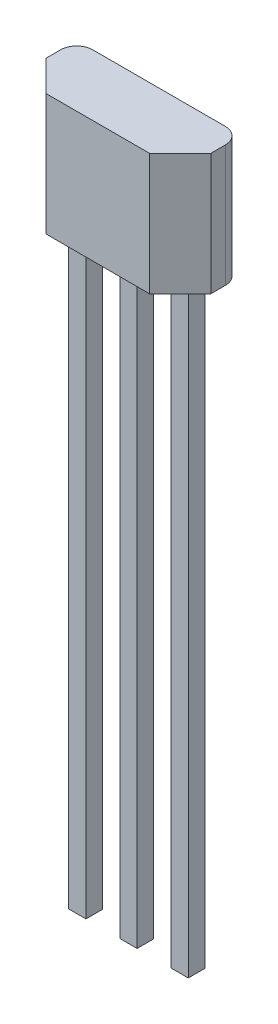
ISO-10303-21;
HEADER;
FILE_DESCRIPTION(('STEP AP214'),'2;1');
FILE_NAME('part.step','',(''),(''),'','','');
FILE_SCHEMA(('AUTOMOTIVE_DESIGN { 1 0 10303 214 1 1 1 1 }'));
ENDSEC;
DATA;
#1=APPLICATION_CONTEXT('core data for automotive mechanical design processes');
#2=APPLICATION_PROTOCOL_DEFINITION('international standard','automotive_design',2000,#1);
#3=PRODUCT_CONTEXT('',#1,'mechanical');
#4=PRODUCT('Part','Part','',(#3));
#5=PRODUCT_RELATED_PRODUCT_CATEGORY('part','',(#4));
#6=PRODUCT_DEFINITION_FORMATION('','',#4);
#7=PRODUCT_DEFINITION_CONTEXT('part definition',#1,'design');
#8=PRODUCT_DEFINITION('design','',#6,#7);
#9=PRODUCT_DEFINITION_SHAPE('','',#8);
#10=(LENGTH_UNIT() NAMED_UNIT(*) SI_UNIT(.MILLI.,.METRE.));
#11=(NAMED_UNIT(*) PLANE_ANGLE_UNIT() SI_UNIT($,.RADIAN.));
#12=(NAMED_UNIT(*) SI_UNIT($,.STERADIAN.) SOLID_ANGLE_UNIT());
#13=UNCERTAINTY_MEASURE_WITH_UNIT(LENGTH_MEASURE(1.E-05),#10,'distance_accuracy_value','');
#14=(GEOMETRIC_REPRESENTATION_CONTEXT(3) GLOBAL_UNCERTAINTY_ASSIGNED_CONTEXT((#13)) GLOBAL_UNIT_ASSIGNED_CONTEXT((#10,
#11,#12)) REPRESENTATION_CONTEXT('',''));
#15=CARTESIAN_POINT('',(0.,0.,0.));
#16=DIRECTION('',(0.,0.,1.));
#17=DIRECTION('',(1.,0.,0.));
#18=AXIS2_PLACEMENT_3D('',#15,#16,#17);
#19=CARTESIAN_POINT('',(1.645,0.,-0.360000000000001));
#20=DIRECTION('',(0.,1.,0.));
#21=DIRECTION('',(0.,0.,1.));
#22=AXIS2_PLACEMENT_3D('',#19,#20,#21);
#23=PLANE('',#22);
#24=DIRECTION('',(-1.,0.,0.));
#25=VECTOR('',#24,1.);
#26=CARTESIAN_POINT('',(1.485,0.,-0.41));
#27=LINE('',#26,#25);
#28=CARTESIAN_POINT('',(1.485,0.,-0.41));
#29=VERTEX_POINT('',#28);
#30=CARTESIAN_POINT('',(1.055,0.,-0.41));
#31=VERTEX_POINT('',#30);
#32=EDGE_CURVE('E213',#29,#31,#27,.T.);
#33=ORIENTED_EDGE('',*,*,#32,.T.);
#34=DIRECTION('',(0.,0.,1.));
#35=VECTOR('',#34,1.);
#36=CARTESIAN_POINT('',(1.055,0.,-0.41));
#37=LINE('',#36,#35);
#38=CARTESIAN_POINT('',(1.055,0.,0.));
#39=VERTEX_POINT('',#38);
#40=EDGE_CURVE('E236',#31,#39,#37,.T.);
#41=ORIENTED_EDGE('',*,*,#40,.T.);
#42=DIRECTION('',(-1.,0.,0.));
#43=VECTOR('',#42,1.);
#44=CARTESIAN_POINT('',(1.485,0.,0.));
#45=LINE('',#44,#43);
#46=CARTESIAN_POINT('',(1.485,0.,0.));
#47=VERTEX_POINT('',#46);
#48=EDGE_CURVE('E225',#47,#39,#45,.T.);
#49=ORIENTED_EDGE('',*,*,#48,.F.);
#50=DIRECTION('',(0.,0.,1.));
#51=VECTOR('',#50,1.);
#52=CARTESIAN_POINT('',(1.485,0.,-0.41));
#53=LINE('',#52,#51);
#54=EDGE_CURVE('E223',#29,#47,#53,.T.);
#55=ORIENTED_EDGE('',*,*,#54,.F.);
#56=EDGE_LOOP('',(#33,#41,#49,#55));
#57=FACE_BOUND('',#56,.T.);
#58=CARTESIAN_POINT('',(1.645,0.,-0.360000000000001));
#59=DIRECTION('',(0.,1.,0.));
#60=DIRECTION('',(0.,0.,1.));
#61=AXIS2_PLACEMENT_3D('',#58,#59,#60);
#62=CIRCLE('',#61,0.4);
#63=CARTESIAN_POINT('',(2.045,0.,-0.360000000000001));
#64=VERTEX_POINT('',#63);
#65=CARTESIAN_POINT('',(1.645,0.,-0.760000000000001));
#66=VERTEX_POINT('',#65);
#67=EDGE_CURVE('E265',#64,#66,#62,.T.);
#68=ORIENTED_EDGE('',*,*,#67,.F.);
#69=DIRECTION('',(0.,0.,-1.));
#70=VECTOR('',#69,1.);
#71=CARTESIAN_POINT('',(2.045,0.,-0.360000000000001));
#72=LINE('',#71,#70);
#73=CARTESIAN_POINT('',(2.045,0.,0.));
#74=VERTEX_POINT('',#73);
#75=EDGE_CURVE('E276',#74,#64,#72,.T.);
#76=ORIENTED_EDGE('',*,*,#75,.F.);
#77=DIRECTION('',(0.707106781186551,0.,-0.707106781186544));
#78=VECTOR('',#77,1.);
#79=CARTESIAN_POINT('',(2.045,0.,0.));
#80=LINE('',#79,#78);
#81=CARTESIAN_POINT('',(1.28499999999999,0.,0.76));
#82=VERTEX_POINT('',#81);
#83=EDGE_CURVE('E303',#82,#74,#80,.T.);
#84=ORIENTED_EDGE('',*,*,#83,.F.);
#85=DIRECTION('',(1.,0.,0.));
#86=VECTOR('',#85,1.);
#87=CARTESIAN_POINT('',(-1.285,0.,0.76));
#88=LINE('',#87,#86);
#89=CARTESIAN_POINT('',(-1.285,0.,0.76));
#90=VERTEX_POINT('',#89);
#91=EDGE_CURVE('E301',#90,#82,#88,.T.);
#92=ORIENTED_EDGE('',*,*,#91,.F.);
#93=DIRECTION('',(0.707106781186546,0.,0.707106781186549));
#94=VECTOR('',#93,1.);
#95=CARTESIAN_POINT('',(-2.045,0.,0.));
#96=LINE('',#95,#94);
#97=CARTESIAN_POINT('',(-2.045,0.,0.));
#98=VERTEX_POINT('',#97);
#99=EDGE_CURVE('E299',#98,#90,#96,.T.);
#100=ORIENTED_EDGE('',*,*,#99,.F.);
#101=DIRECTION('',(0.,0.,1.));
#102=VECTOR('',#101,1.);
#103=CARTESIAN_POINT('',(-2.045,0.,-0.36));
#104=LINE('',#103,#102);
#105=CARTESIAN_POINT('',(-2.045,0.,-0.36));
#106=VERTEX_POINT('',#105);
#107=EDGE_CURVE('E297',#106,#98,#104,.T.);
#108=ORIENTED_EDGE('',*,*,#107,.F.);
#109=CARTESIAN_POINT('',(-1.645,0.,-0.36));
#110=DIRECTION('',(0.,1.,0.));
#111=DIRECTION('',(0.,0.,1.));
#112=AXIS2_PLACEMENT_3D('',#109,#110,#111);
#113=CIRCLE('',#112,0.4);
#114=CARTESIAN_POINT('',(-1.645,0.,-0.76));
#115=VERTEX_POINT('',#114);
#116=EDGE_CURVE('E295',#115,#106,#113,.T.);
#117=ORIENTED_EDGE('',*,*,#116,.F.);
#118=DIRECTION('',(-1.,0.,0.));
#119=VECTOR('',#118,1.);
#120=CARTESIAN_POINT('',(-1.645,0.,-0.76));
#121=LINE('',#120,#119);
#122=EDGE_CURVE('E293',#66,#115,#121,.T.);
#123=ORIENTED_EDGE('',*,*,#122,.F.);
#124=EDGE_LOOP('',(#68,#76,#84,#92,#100,#108,#117,#123));
#125=FACE_BOUND('',#124,.T.);
#126=DIRECTION('',(-1.,0.,0.));
#127=VECTOR('',#126,1.);
#128=CARTESIAN_POINT('',(-0.215,0.,-0.41));
#129=LINE('',#128,#127);
#130=CARTESIAN_POINT('',(0.215,0.,-0.41));
#131=VERTEX_POINT('',#130);
#132=CARTESIAN_POINT('',(-0.215,0.,-0.41));
#133=VERTEX_POINT('',#132);
#134=EDGE_CURVE('E249',#131,#133,#129,.T.);
#135=ORIENTED_EDGE('',*,*,#134,.T.);
#136=DIRECTION('',(0.,0.,1.));
#137=VECTOR('',#136,1.);
#138=CARTESIAN_POINT('',(-0.215,0.,-0.41));
#139=LINE('',#138,#137);
#140=CARTESIAN_POINT('',(-0.215,0.,0.));
#141=VERTEX_POINT('',#140);
#142=EDGE_CURVE('E262',#133,#141,#139,.T.);
#143=ORIENTED_EDGE('',*,*,#142,.T.);
#144=DIRECTION('',(-1.,0.,0.));
#145=VECTOR('',#144,1.);
#146=CARTESIAN_POINT('',(-0.215,0.,0.));
#147=LINE('',#146,#145);
#148=CARTESIAN_POINT('',(0.215000000000002,0.,0.));
#149=VERTEX_POINT('',#148);
#150=EDGE_CURVE('E244',#149,#141,#147,.T.);
#151=ORIENTED_EDGE('',*,*,#150,.F.);
#152=DIRECTION('',(0.,0.,1.));
#153=VECTOR('',#152,1.);
#154=CARTESIAN_POINT('',(0.215,0.,-0.41));
#155=LINE('',#154,#153);
#156=EDGE_CURVE('E266',#131,#149,#155,.T.);
#157=ORIENTED_EDGE('',*,*,#156,.F.);
#158=EDGE_LOOP('',(#135,#143,#151,#157));
#159=FACE_BOUND('',#158,.T.);
#160=DIRECTION('',(-1.,0.,0.));
#161=VECTOR('',#160,1.);
#162=CARTESIAN_POINT('',(-1.485,0.,-0.41));
#163=LINE('',#162,#161);
#164=CARTESIAN_POINT('',(-1.055,0.,-0.41));
#165=VERTEX_POINT('',#164);
#166=CARTESIAN_POINT('',(-1.485,0.,-0.41));
#167=VERTEX_POINT('',#166);
#168=EDGE_CURVE('E182',#165,#167,#163,.T.);
#169=ORIENTED_EDGE('',*,*,#168,.T.);
#170=DIRECTION('',(0.,0.,1.));
#171=VECTOR('',#170,1.);
#172=CARTESIAN_POINT('',(-1.485,0.,-0.41));
#173=LINE('',#172,#171);
#174=CARTESIAN_POINT('',(-1.485,0.,0.));
#175=VERTEX_POINT('',#174);
#176=EDGE_CURVE('E195',#167,#175,#173,.T.);
#177=ORIENTED_EDGE('',*,*,#176,.T.);
#178=DIRECTION('',(-1.,0.,0.));
#179=VECTOR('',#178,1.);
#180=CARTESIAN_POINT('',(-1.485,0.,0.));
#181=LINE('',#180,#179);
#182=CARTESIAN_POINT('',(-1.055,0.,0.));
#183=VERTEX_POINT('',#182);
#184=EDGE_CURVE('E196',#183,#175,#181,.T.);
#185=ORIENTED_EDGE('',*,*,#184,.F.);
#186=DIRECTION('',(0.,0.,1.));
#187=VECTOR('',#186,1.);
#188=CARTESIAN_POINT('',(-1.055,0.,-0.41));
#189=LINE('',#188,#187);
#190=EDGE_CURVE('E207',#165,#183,#189,.T.);
#191=ORIENTED_EDGE('',*,*,#190,.F.);
#192=EDGE_LOOP('',(#169,#177,#185,#191));
#193=FACE_BOUND('',#192,.T.);
#194=ADVANCED_FACE('F32',(#57,#125,#159,#193),#23,.F.);
#195=CARTESIAN_POINT('',(1.645,3.02,-0.360000000000001));
#196=DIRECTION('',(0.,-1.,0.));
#197=DIRECTION('',(0.,0.,-1.));
#198=AXIS2_PLACEMENT_3D('',#195,#196,#197);
#199=CYLINDRICAL_SURFACE('',#198,0.4);
#200=ORIENTED_EDGE('',*,*,#67,.T.);
#201=DIRECTION('',(0.,-1.,0.));
#202=VECTOR('',#201,1.);
#203=CARTESIAN_POINT('',(1.645,3.02,-0.760000000000001));
#204=LINE('',#203,#202);
#205=CARTESIAN_POINT('',(1.645,3.02,-0.760000000000001));
#206=VERTEX_POINT('',#205);
#207=EDGE_CURVE('E11',#206,#66,#204,.T.);
#208=ORIENTED_EDGE('',*,*,#207,.F.);
#209=CARTESIAN_POINT('',(1.645,3.02,-0.360000000000001));
#210=DIRECTION('',(0.,1.,0.));
#211=DIRECTION('',(0.,0.,1.));
#212=AXIS2_PLACEMENT_3D('',#209,#210,#211);
#213=CIRCLE('',#212,0.4);
#214=CARTESIAN_POINT('',(2.045,3.02,-0.360000000000001));
#215=VERTEX_POINT('',#214);
#216=EDGE_CURVE('E272',#215,#206,#213,.T.);
#217=ORIENTED_EDGE('',*,*,#216,.F.);
#218=DIRECTION('',(0.,-1.,0.));
#219=VECTOR('',#218,1.);
#220=CARTESIAN_POINT('',(2.045,3.02,-0.360000000000001));
#221=LINE('',#220,#219);
#222=EDGE_CURVE('E290',#215,#64,#221,.T.);
#223=ORIENTED_EDGE('',*,*,#222,.T.);
#224=EDGE_LOOP('',(#200,#208,#217,#223));
#225=FACE_BOUND('',#224,.T.);
#226=ADVANCED_FACE('F34',(#225),#199,.T.);
#227=CARTESIAN_POINT('',(-1.645,3.02,-0.76));
#228=DIRECTION('',(0.,0.,1.));
#229=DIRECTION('',(1.,0.,0.));
#230=AXIS2_PLACEMENT_3D('',#227,#228,#229);
#231=PLANE('',#230);
#232=ORIENTED_EDGE('',*,*,#122,.T.);
#233=DIRECTION('',(0.,-1.,0.));
#234=VECTOR('',#233,1.);
#235=CARTESIAN_POINT('',(-1.645,3.02,-0.76));
#236=LINE('',#235,#234);
#237=CARTESIAN_POINT('',(-1.645,3.02,-0.76));
#238=VERTEX_POINT('',#237);
#239=EDGE_CURVE('E40',#238,#115,#236,.T.);
#240=ORIENTED_EDGE('',*,*,#239,.F.);
#241=DIRECTION('',(-1.,0.,0.));
#242=VECTOR('',#241,1.);
#243=CARTESIAN_POINT('',(-1.645,3.02,-0.76));
#244=LINE('',#243,#242);
#245=EDGE_CURVE('E275',#206,#238,#244,.T.);
#246=ORIENTED_EDGE('',*,*,#245,.F.);
#247=ORIENTED_EDGE('',*,*,#207,.T.);
#248=EDGE_LOOP('',(#232,#240,#246,#247));
#249=FACE_BOUND('',#248,.T.);
#250=ADVANCED_FACE('F350',(#249),#231,.F.);
#251=CARTESIAN_POINT('',(-1.645,3.02,-0.36));
#252=DIRECTION('',(0.,-1.,0.));
#253=DIRECTION('',(0.,0.,-1.));
#254=AXIS2_PLACEMENT_3D('',#251,#252,#253);
#255=CYLINDRICAL_SURFACE('',#254,0.4);
#256=ORIENTED_EDGE('',*,*,#116,.T.);
#257=DIRECTION('',(0.,-1.,0.));
#258=VECTOR('',#257,1.);
#259=CARTESIAN_POINT('',(-2.045,3.02,-0.36));
#260=LINE('',#259,#258);
#261=CARTESIAN_POINT('',(-2.045,3.02,-0.36));
#262=VERTEX_POINT('',#261);
#263=EDGE_CURVE('E320',#262,#106,#260,.T.);
#264=ORIENTED_EDGE('',*,*,#263,.F.);
#265=CARTESIAN_POINT('',(-1.645,3.02,-0.36));
#266=DIRECTION('',(0.,1.,0.));
#267=DIRECTION('',(0.,0.,1.));
#268=AXIS2_PLACEMENT_3D('',#265,#266,#267);
#269=CIRCLE('',#268,0.4);
#270=EDGE_CURVE('E278',#238,#262,#269,.T.);
#271=ORIENTED_EDGE('',*,*,#270,.F.);
#272=ORIENTED_EDGE('',*,*,#239,.T.);
#273=EDGE_LOOP('',(#256,#264,#271,#272));
#274=FACE_BOUND('',#273,.T.);
#275=ADVANCED_FACE('F327',(#274),#255,.T.);
#276=CARTESIAN_POINT('',(-2.045,3.02,-0.36));
#277=DIRECTION('',(1.,0.,0.));
#278=DIRECTION('',(0.,0.,-1.));
#279=AXIS2_PLACEMENT_3D('',#276,#277,#278);
#280=PLANE('',#279);
#281=ORIENTED_EDGE('',*,*,#107,.T.);
#282=DIRECTION('',(0.,-1.,0.));
#283=VECTOR('',#282,1.);
#284=CARTESIAN_POINT('',(-2.045,3.02,0.));
#285=LINE('',#284,#283);
#286=CARTESIAN_POINT('',(-2.045,3.02,0.));
#287=VERTEX_POINT('',#286);
#288=EDGE_CURVE('E317',#287,#98,#285,.T.);
#289=ORIENTED_EDGE('',*,*,#288,.F.);
#290=DIRECTION('',(0.,0.,1.));
#291=VECTOR('',#290,1.);
#292=CARTESIAN_POINT('',(-2.045,3.02,-0.36));
#293=LINE('',#292,#291);
#294=EDGE_CURVE('E280',#262,#287,#293,.T.);
#295=ORIENTED_EDGE('',*,*,#294,.F.);
#296=ORIENTED_EDGE('',*,*,#263,.T.);
#297=EDGE_LOOP('',(#281,#289,#295,#296));
#298=FACE_BOUND('',#297,.T.);
#299=ADVANCED_FACE('F338',(#298),#280,.F.);
#300=CARTESIAN_POINT('',(-2.045,3.02,0.));
#301=DIRECTION('',(0.707106781186549,0.,-0.707106781186546));
#302=DIRECTION('',(-0.707106781186546,0.,-0.707106781186549));
#303=AXIS2_PLACEMENT_3D('',#300,#301,#302);
#304=PLANE('',#303);
#305=ORIENTED_EDGE('',*,*,#99,.T.);
#306=DIRECTION('',(0.,-1.,0.));
#307=VECTOR('',#306,1.);
#308=CARTESIAN_POINT('',(-1.285,3.02,0.76));
#309=LINE('',#308,#307);
#310=CARTESIAN_POINT('',(-1.285,3.02,0.76));
#311=VERTEX_POINT('',#310);
#312=EDGE_CURVE('E314',#311,#90,#309,.T.);
#313=ORIENTED_EDGE('',*,*,#312,.F.);
#314=DIRECTION('',(0.707106781186546,0.,0.707106781186549));
#315=VECTOR('',#314,1.);
#316=CARTESIAN_POINT('',(-2.045,3.02,0.));
#317=LINE('',#316,#315);
#318=EDGE_CURVE('E282',#287,#311,#317,.T.);
#319=ORIENTED_EDGE('',*,*,#318,.F.);
#320=ORIENTED_EDGE('',*,*,#288,.T.);
#321=EDGE_LOOP('',(#305,#313,#319,#320));
#322=FACE_BOUND('',#321,.T.);
#323=ADVANCED_FACE('F342',(#322),#304,.F.);
#324=CARTESIAN_POINT('',(-1.285,3.02,0.76));
#325=DIRECTION('',(0.,0.,-1.));
#326=DIRECTION('',(-1.,0.,0.));
#327=AXIS2_PLACEMENT_3D('',#324,#325,#326);
#328=PLANE('',#327);
#329=ORIENTED_EDGE('',*,*,#91,.T.);
#330=DIRECTION('',(0.,-1.,0.));
#331=VECTOR('',#330,1.);
#332=CARTESIAN_POINT('',(1.28499999999999,3.02,0.76));
#333=LINE('',#332,#331);
#334=CARTESIAN_POINT('',(1.28499999999999,3.02,0.76));
#335=VERTEX_POINT('',#334);
#336=EDGE_CURVE('E311',#335,#82,#333,.T.);
#337=ORIENTED_EDGE('',*,*,#336,.F.);
#338=DIRECTION('',(1.,0.,0.));
#339=VECTOR('',#338,1.);
#340=CARTESIAN_POINT('',(-1.285,3.02,0.76));
#341=LINE('',#340,#339);
#342=EDGE_CURVE('E284',#311,#335,#341,.T.);
#343=ORIENTED_EDGE('',*,*,#342,.F.);
#344=ORIENTED_EDGE('',*,*,#312,.T.);
#345=EDGE_LOOP('',(#329,#337,#343,#344));
#346=FACE_BOUND('',#345,.T.);
#347=ADVANCED_FACE('F363',(#346),#328,.F.);
#348=CARTESIAN_POINT('',(2.045,3.02,0.));
#349=DIRECTION('',(-0.707106781186544,0.,-0.707106781186551));
#350=DIRECTION('',(-0.707106781186551,0.,0.707106781186544));
#351=AXIS2_PLACEMENT_3D('',#348,#349,#350);
#352=PLANE('',#351);
#353=ORIENTED_EDGE('',*,*,#83,.T.);
#354=DIRECTION('',(0.,-1.,0.));
#355=VECTOR('',#354,1.);
#356=CARTESIAN_POINT('',(2.045,3.02,0.));
#357=LINE('',#356,#355);
#358=CARTESIAN_POINT('',(2.045,3.02,0.));
#359=VERTEX_POINT('',#358);
#360=EDGE_CURVE('E308',#359,#74,#357,.T.);
#361=ORIENTED_EDGE('',*,*,#360,.F.);
#362=DIRECTION('',(0.707106781186551,0.,-0.707106781186544));
#363=VECTOR('',#362,1.);
#364=CARTESIAN_POINT('',(2.045,3.02,0.));
#365=LINE('',#364,#363);
#366=EDGE_CURVE('E286',#335,#359,#365,.T.);
#367=ORIENTED_EDGE('',*,*,#366,.F.);
#368=ORIENTED_EDGE('',*,*,#336,.T.);
#369=EDGE_LOOP('',(#353,#361,#367,#368));
#370=FACE_BOUND('',#369,.T.);
#371=ADVANCED_FACE('F361',(#370),#352,.F.);
#372=CARTESIAN_POINT('',(2.045,3.02,-0.360000000000001));
#373=DIRECTION('',(-1.,0.,0.));
#374=DIRECTION('',(0.,0.,1.));
#375=AXIS2_PLACEMENT_3D('',#372,#373,#374);
#376=PLANE('',#375);
#377=ORIENTED_EDGE('',*,*,#75,.T.);
#378=ORIENTED_EDGE('',*,*,#222,.F.);
#379=DIRECTION('',(0.,0.,-1.));
#380=VECTOR('',#379,1.);
#381=CARTESIAN_POINT('',(2.045,3.02,-0.360000000000001));
#382=LINE('',#381,#380);
#383=EDGE_CURVE('E288',#359,#215,#382,.T.);
#384=ORIENTED_EDGE('',*,*,#383,.F.);
#385=ORIENTED_EDGE('',*,*,#360,.T.);
#386=EDGE_LOOP('',(#377,#378,#384,#385));
#387=FACE_BOUND('',#386,.T.);
#388=ADVANCED_FACE('F356',(#387),#376,.F.);
#389=CARTESIAN_POINT('',(1.645,3.02,-0.360000000000001));
#390=DIRECTION('',(0.,1.,0.));
#391=DIRECTION('',(0.,0.,1.));
#392=AXIS2_PLACEMENT_3D('',#389,#390,#391);
#393=PLANE('',#392);
#394=ORIENTED_EDGE('',*,*,#216,.T.);
#395=ORIENTED_EDGE('',*,*,#245,.T.);
#396=ORIENTED_EDGE('',*,*,#270,.T.);
#397=ORIENTED_EDGE('',*,*,#294,.T.);
#398=ORIENTED_EDGE('',*,*,#318,.T.);
#399=ORIENTED_EDGE('',*,*,#342,.T.);
#400=ORIENTED_EDGE('',*,*,#366,.T.);
#401=ORIENTED_EDGE('',*,*,#383,.T.);
#402=EDGE_LOOP('',(#394,#395,#396,#397,#398,#399,#400,#401));
#403=FACE_BOUND('',#402,.T.);
#404=ADVANCED_FACE('F346',(#403),#393,.T.);
#405=CARTESIAN_POINT('',(-0.215,0.,-0.41));
#406=DIRECTION('',(-1.,0.,0.));
#407=DIRECTION('',(0.,-1.,0.));
#408=AXIS2_PLACEMENT_3D('',#405,#406,#407);
#409=PLANE('',#408);
#410=DIRECTION('',(0.,-1.,0.));
#411=VECTOR('',#410,1.);
#412=CARTESIAN_POINT('',(-0.215,0.,0.));
#413=LINE('',#412,#411);
#414=CARTESIAN_POINT('',(-0.214999999999996,-14.99,0.));
#415=VERTEX_POINT('',#414);
#416=EDGE_CURVE('E233',#141,#415,#413,.T.);
#417=ORIENTED_EDGE('',*,*,#416,.F.);
#418=ORIENTED_EDGE('',*,*,#142,.F.);
#419=DIRECTION('',(0.,-1.,0.));
#420=VECTOR('',#419,1.);
#421=CARTESIAN_POINT('',(-0.215,0.,-0.41));
#422=LINE('',#421,#420);
#423=CARTESIAN_POINT('',(-0.214999999999996,-14.99,-0.41));
#424=VERTEX_POINT('',#423);
#425=EDGE_CURVE('E240',#133,#424,#422,.T.);
#426=ORIENTED_EDGE('',*,*,#425,.T.);
#427=DIRECTION('',(0.,0.,1.));
#428=VECTOR('',#427,1.);
#429=CARTESIAN_POINT('',(-0.214999999999996,-14.99,-0.41));
#430=LINE('',#429,#428);
#431=EDGE_CURVE('E252',#424,#415,#430,.T.);
#432=ORIENTED_EDGE('',*,*,#431,.T.);
#433=EDGE_LOOP('',(#417,#418,#426,#432));
#434=FACE_BOUND('',#433,.T.);
#435=ADVANCED_FACE('F385',(#434),#409,.T.);
#436=CARTESIAN_POINT('',(0.215,0.,-0.41));
#437=DIRECTION('',(1.,0.,0.));
#438=DIRECTION('',(0.,1.,0.));
#439=AXIS2_PLACEMENT_3D('',#436,#437,#438);
#440=PLANE('',#439);
#441=DIRECTION('',(0.,1.,0.));
#442=VECTOR('',#441,1.);
#443=CARTESIAN_POINT('',(0.215,0.,0.));
#444=LINE('',#443,#442);
#445=CARTESIAN_POINT('',(0.215000000000002,-14.99,0.));
#446=VERTEX_POINT('',#445);
#447=EDGE_CURVE('E258',#446,#149,#444,.T.);
#448=ORIENTED_EDGE('',*,*,#447,.F.);
#449=DIRECTION('',(0.,0.,1.));
#450=VECTOR('',#449,1.);
#451=CARTESIAN_POINT('',(0.215000000000002,-14.99,-0.41));
#452=LINE('',#451,#450);
#453=CARTESIAN_POINT('',(0.215000000000002,-14.99,-0.41));
#454=VERTEX_POINT('',#453);
#455=EDGE_CURVE('E269',#454,#446,#452,.T.);
#456=ORIENTED_EDGE('',*,*,#455,.F.);
#457=DIRECTION('',(0.,1.,0.));
#458=VECTOR('',#457,1.);
#459=CARTESIAN_POINT('',(0.215,0.,-0.41));
#460=LINE('',#459,#458);
#461=EDGE_CURVE('E247',#454,#131,#460,.T.);
#462=ORIENTED_EDGE('',*,*,#461,.T.);
#463=ORIENTED_EDGE('',*,*,#156,.T.);
#464=EDGE_LOOP('',(#448,#456,#462,#463));
#465=FACE_BOUND('',#464,.T.);
#466=ADVANCED_FACE('F389',(#465),#440,.T.);
#467=CARTESIAN_POINT('',(-0.214999999999996,-14.99,-0.41));
#468=DIRECTION('',(0.,-1.,0.));
#469=DIRECTION('',(0.,0.,-1.));
#470=AXIS2_PLACEMENT_3D('',#467,#468,#469);
#471=PLANE('',#470);
#472=DIRECTION('',(1.,0.,0.));
#473=VECTOR('',#472,1.);
#474=CARTESIAN_POINT('',(-0.214999999999996,-14.99,0.));
#475=LINE('',#474,#473);
#476=EDGE_CURVE('E255',#415,#446,#475,.T.);
#477=ORIENTED_EDGE('',*,*,#476,.F.);
#478=ORIENTED_EDGE('',*,*,#431,.F.);
#479=DIRECTION('',(1.,0.,0.));
#480=VECTOR('',#479,1.);
#481=CARTESIAN_POINT('',(-0.214999999999996,-14.99,-0.41));
#482=LINE('',#481,#480);
#483=EDGE_CURVE('E243',#424,#454,#482,.T.);
#484=ORIENTED_EDGE('',*,*,#483,.T.);
#485=ORIENTED_EDGE('',*,*,#455,.T.);
#486=EDGE_LOOP('',(#477,#478,#484,#485));
#487=FACE_BOUND('',#486,.T.);
#488=ADVANCED_FACE('F394',(#487),#471,.T.);
#489=CARTESIAN_POINT('',(0.,0.,-0.41));
#490=DIRECTION('',(0.,0.,1.));
#491=DIRECTION('',(1.,0.,0.));
#492=AXIS2_PLACEMENT_3D('',#489,#490,#491);
#493=PLANE('',#492);
#494=ORIENTED_EDGE('',*,*,#425,.F.);
#495=ORIENTED_EDGE('',*,*,#134,.F.);
#496=ORIENTED_EDGE('',*,*,#461,.F.);
#497=ORIENTED_EDGE('',*,*,#483,.F.);
#498=EDGE_LOOP('',(#494,#495,#496,#497));
#499=FACE_BOUND('',#498,.T.);
#500=ADVANCED_FACE('F399',(#499),#493,.F.);
#501=CARTESIAN_POINT('',(0.,0.,0.));
#502=DIRECTION('',(0.,0.,1.));
#503=DIRECTION('',(1.,0.,0.));
#504=AXIS2_PLACEMENT_3D('',#501,#502,#503);
#505=PLANE('',#504);
#506=ORIENTED_EDGE('',*,*,#416,.T.);
#507=ORIENTED_EDGE('',*,*,#476,.T.);
#508=ORIENTED_EDGE('',*,*,#447,.T.);
#509=ORIENTED_EDGE('',*,*,#150,.T.);
#510=EDGE_LOOP('',(#506,#507,#508,#509));
#511=FACE_BOUND('',#510,.T.);
#512=ADVANCED_FACE('F402',(#511),#505,.T.);
#513=CARTESIAN_POINT('',(1.485,-14.99,-0.41));
#514=DIRECTION('',(1.,0.,0.));
#515=DIRECTION('',(0.,1.,0.));
#516=AXIS2_PLACEMENT_3D('',#513,#514,#515);
#517=PLANE('',#516);
#518=DIRECTION('',(0.,1.,0.));
#519=VECTOR('',#518,1.);
#520=CARTESIAN_POINT('',(1.485,-14.99,0.));
#521=LINE('',#520,#519);
#522=CARTESIAN_POINT('',(1.485,-14.99,0.));
#523=VERTEX_POINT('',#522);
#524=EDGE_CURVE('E55',#523,#47,#521,.T.);
#525=ORIENTED_EDGE('',*,*,#524,.F.);
#526=DIRECTION('',(0.,0.,1.));
#527=VECTOR('',#526,1.);
#528=CARTESIAN_POINT('',(1.485,-14.99,-0.41));
#529=LINE('',#528,#527);
#530=CARTESIAN_POINT('',(1.485,-14.99,-0.41));
#531=VERTEX_POINT('',#530);
#532=EDGE_CURVE('E231',#531,#523,#529,.T.);
#533=ORIENTED_EDGE('',*,*,#532,.F.);
#534=DIRECTION('',(0.,1.,0.));
#535=VECTOR('',#534,1.);
#536=CARTESIAN_POINT('',(1.485,-14.99,-0.41));
#537=LINE('',#536,#535);
#538=EDGE_CURVE('E210',#531,#29,#537,.T.);
#539=ORIENTED_EDGE('',*,*,#538,.T.);
#540=ORIENTED_EDGE('',*,*,#54,.T.);
#541=EDGE_LOOP('',(#525,#533,#539,#540));
#542=FACE_BOUND('',#541,.T.);
#543=ADVANCED_FACE('F405',(#542),#517,.T.);
#544=CARTESIAN_POINT('',(1.485,-14.99,-0.41));
#545=DIRECTION('',(0.,-1.,0.));
#546=DIRECTION('',(0.,0.,-1.));
#547=AXIS2_PLACEMENT_3D('',#544,#545,#546);
#548=PLANE('',#547);
#549=DIRECTION('',(1.,0.,0.));
#550=VECTOR('',#549,1.);
#551=CARTESIAN_POINT('',(1.485,-14.99,0.));
#552=LINE('',#551,#550);
#553=CARTESIAN_POINT('',(1.055,-14.99,0.));
#554=VERTEX_POINT('',#553);
#555=EDGE_CURVE('E214',#554,#523,#552,.T.);
#556=ORIENTED_EDGE('',*,*,#555,.F.);
#557=DIRECTION('',(0.,0.,1.));
#558=VECTOR('',#557,1.);
#559=CARTESIAN_POINT('',(1.055,-14.99,-0.41));
#560=LINE('',#559,#558);
#561=CARTESIAN_POINT('',(1.055,-14.99,-0.41));
#562=VERTEX_POINT('',#561);
#563=EDGE_CURVE('E234',#562,#554,#560,.T.);
#564=ORIENTED_EDGE('',*,*,#563,.F.);
#565=DIRECTION('',(1.,0.,0.));
#566=VECTOR('',#565,1.);
#567=CARTESIAN_POINT('',(1.485,-14.99,-0.41));
#568=LINE('',#567,#566);
#569=EDGE_CURVE('E220',#562,#531,#568,.T.);
#570=ORIENTED_EDGE('',*,*,#569,.T.);
#571=ORIENTED_EDGE('',*,*,#532,.T.);
#572=EDGE_LOOP('',(#556,#564,#570,#571));
#573=FACE_BOUND('',#572,.T.);
#574=ADVANCED_FACE('F412',(#573),#548,.T.);
#575=CARTESIAN_POINT('',(1.055,-14.99,-0.41));
#576=DIRECTION('',(-1.,0.,0.));
#577=DIRECTION('',(0.,-1.,0.));
#578=AXIS2_PLACEMENT_3D('',#575,#576,#577);
#579=PLANE('',#578);
#580=DIRECTION('',(0.,-1.,0.));
#581=VECTOR('',#580,1.);
#582=CARTESIAN_POINT('',(1.055,-14.99,0.));
#583=LINE('',#582,#581);
#584=EDGE_CURVE('E227',#39,#554,#583,.T.);
#585=ORIENTED_EDGE('',*,*,#584,.F.);
#586=ORIENTED_EDGE('',*,*,#40,.F.);
#587=DIRECTION('',(0.,-1.,0.));
#588=VECTOR('',#587,1.);
#589=CARTESIAN_POINT('',(1.055,-14.99,-0.41));
#590=LINE('',#589,#588);
#591=EDGE_CURVE('E217',#31,#562,#590,.T.);
#592=ORIENTED_EDGE('',*,*,#591,.T.);
#593=ORIENTED_EDGE('',*,*,#563,.T.);
#594=EDGE_LOOP('',(#585,#586,#592,#593));
#595=FACE_BOUND('',#594,.T.);
#596=ADVANCED_FACE('F414',(#595),#579,.T.);
#597=CARTESIAN_POINT('',(0.,0.,-0.41));
#598=DIRECTION('',(0.,0.,1.));
#599=DIRECTION('',(1.,0.,0.));
#600=AXIS2_PLACEMENT_3D('',#597,#598,#599);
#601=PLANE('',#600);
#602=ORIENTED_EDGE('',*,*,#538,.F.);
#603=ORIENTED_EDGE('',*,*,#569,.F.);
#604=ORIENTED_EDGE('',*,*,#591,.F.);
#605=ORIENTED_EDGE('',*,*,#32,.F.);
#606=EDGE_LOOP('',(#602,#603,#604,#605));
#607=FACE_BOUND('',#606,.T.);
#608=ADVANCED_FACE('F417',(#607),#601,.F.);
#609=CARTESIAN_POINT('',(0.,0.,0.));
#610=DIRECTION('',(0.,0.,1.));
#611=DIRECTION('',(1.,0.,0.));
#612=AXIS2_PLACEMENT_3D('',#609,#610,#611);
#613=PLANE('',#612);
#614=ORIENTED_EDGE('',*,*,#524,.T.);
#615=ORIENTED_EDGE('',*,*,#48,.T.);
#616=ORIENTED_EDGE('',*,*,#584,.T.);
#617=ORIENTED_EDGE('',*,*,#555,.T.);
#618=EDGE_LOOP('',(#614,#615,#616,#617));
#619=FACE_BOUND('',#618,.T.);
#620=ADVANCED_FACE('F422',(#619),#613,.T.);
#621=CARTESIAN_POINT('',(-1.485,0.,-0.41));
#622=DIRECTION('',(-1.,0.,0.));
#623=DIRECTION('',(0.,-1.,0.));
#624=AXIS2_PLACEMENT_3D('',#621,#622,#623);
#625=PLANE('',#624);
#626=DIRECTION('',(0.,-1.,0.));
#627=VECTOR('',#626,1.);
#628=CARTESIAN_POINT('',(-1.485,0.,0.));
#629=LINE('',#628,#627);
#630=CARTESIAN_POINT('',(-1.485,-14.99,0.));
#631=VERTEX_POINT('',#630);
#632=EDGE_CURVE('E202',#175,#631,#629,.T.);
#633=ORIENTED_EDGE('',*,*,#632,.F.);
#634=ORIENTED_EDGE('',*,*,#176,.F.);
#635=DIRECTION('',(0.,-1.,0.));
#636=VECTOR('',#635,1.);
#637=CARTESIAN_POINT('',(-1.485,0.,-0.41));
#638=LINE('',#637,#636);
#639=CARTESIAN_POINT('',(-1.485,-14.99,-0.41));
#640=VERTEX_POINT('',#639);
#641=EDGE_CURVE('E189',#167,#640,#638,.T.);
#642=ORIENTED_EDGE('',*,*,#641,.T.);
#643=DIRECTION('',(0.,0.,1.));
#644=VECTOR('',#643,1.);
#645=CARTESIAN_POINT('',(-1.485,-14.99,-0.41));
#646=LINE('',#645,#644);
#647=EDGE_CURVE('E173',#640,#631,#646,.T.);
#648=ORIENTED_EDGE('',*,*,#647,.T.);
#649=EDGE_LOOP('',(#633,#634,#642,#648));
#650=FACE_BOUND('',#649,.T.);
#651=ADVANCED_FACE('F193',(#650),#625,.T.);
#652=CARTESIAN_POINT('',(-1.055,0.,-0.41));
#653=DIRECTION('',(1.,0.,0.));
#654=DIRECTION('',(0.,1.,0.));
#655=AXIS2_PLACEMENT_3D('',#652,#653,#654);
#656=PLANE('',#655);
#657=DIRECTION('',(0.,1.,0.));
#658=VECTOR('',#657,1.);
#659=CARTESIAN_POINT('',(-1.055,0.,0.));
#660=LINE('',#659,#658);
#661=CARTESIAN_POINT('',(-1.055,-14.99,0.));
#662=VERTEX_POINT('',#661);
#663=EDGE_CURVE('E47',#662,#183,#660,.T.);
#664=ORIENTED_EDGE('',*,*,#663,.F.);
#665=DIRECTION('',(0.,0.,1.));
#666=VECTOR('',#665,1.);
#667=CARTESIAN_POINT('',(-1.055,-14.99,-0.41));
#668=LINE('',#667,#666);
#669=CARTESIAN_POINT('',(-1.055,-14.99,-0.41));
#670=VERTEX_POINT('',#669);
#671=EDGE_CURVE('E181',#670,#662,#668,.T.);
#672=ORIENTED_EDGE('',*,*,#671,.F.);
#673=DIRECTION('',(0.,1.,0.));
#674=VECTOR('',#673,1.);
#675=CARTESIAN_POINT('',(-1.055,0.,-0.41));
#676=LINE('',#675,#674);
#677=EDGE_CURVE('E191',#670,#165,#676,.T.);
#678=ORIENTED_EDGE('',*,*,#677,.T.);
#679=ORIENTED_EDGE('',*,*,#190,.T.);
#680=EDGE_LOOP('',(#664,#672,#678,#679));
#681=FACE_BOUND('',#680,.T.);
#682=ADVANCED_FACE('F430',(#681),#656,.T.);
#683=CARTESIAN_POINT('',(-1.485,-14.99,-0.41));
#684=DIRECTION('',(0.,-1.,0.));
#685=DIRECTION('',(0.,0.,-1.));
#686=AXIS2_PLACEMENT_3D('',#683,#684,#685);
#687=PLANE('',#686);
#688=DIRECTION('',(1.,0.,0.));
#689=VECTOR('',#688,1.);
#690=CARTESIAN_POINT('',(-1.485,-14.99,0.));
#691=LINE('',#690,#689);
#692=EDGE_CURVE('E177',#631,#662,#691,.T.);
#693=ORIENTED_EDGE('',*,*,#692,.F.);
#694=ORIENTED_EDGE('',*,*,#647,.F.);
#695=DIRECTION('',(1.,0.,0.));
#696=VECTOR('',#695,1.);
#697=CARTESIAN_POINT('',(-1.485,-14.99,-0.41));
#698=LINE('',#697,#696);
#699=EDGE_CURVE('E176',#640,#670,#698,.T.);
#700=ORIENTED_EDGE('',*,*,#699,.T.);
#701=ORIENTED_EDGE('',*,*,#671,.T.);
#702=EDGE_LOOP('',(#693,#694,#700,#701));
#703=FACE_BOUND('',#702,.T.);
#704=ADVANCED_FACE('F175',(#703),#687,.T.);
#705=CARTESIAN_POINT('',(0.,0.,-0.41));
#706=DIRECTION('',(0.,0.,1.));
#707=DIRECTION('',(1.,0.,0.));
#708=AXIS2_PLACEMENT_3D('',#705,#706,#707);
#709=PLANE('',#708);
#710=ORIENTED_EDGE('',*,*,#641,.F.);
#711=ORIENTED_EDGE('',*,*,#168,.F.);
#712=ORIENTED_EDGE('',*,*,#677,.F.);
#713=ORIENTED_EDGE('',*,*,#699,.F.);
#714=EDGE_LOOP('',(#710,#711,#712,#713));
#715=FACE_BOUND('',#714,.T.);
#716=ADVANCED_FACE('F187',(#715),#709,.F.);
#717=CARTESIAN_POINT('',(0.,0.,0.));
#718=DIRECTION('',(0.,0.,1.));
#719=DIRECTION('',(1.,0.,0.));
#720=AXIS2_PLACEMENT_3D('',#717,#718,#719);
#721=PLANE('',#720);
#722=ORIENTED_EDGE('',*,*,#632,.T.);
#723=ORIENTED_EDGE('',*,*,#692,.T.);
#724=ORIENTED_EDGE('',*,*,#663,.T.);
#725=ORIENTED_EDGE('',*,*,#184,.T.);
#726=EDGE_LOOP('',(#722,#723,#724,#725));
#727=FACE_BOUND('',#726,.T.);
#728=ADVANCED_FACE('F436',(#727),#721,.T.);
#729=CLOSED_SHELL('',(#194,#226,#250,#275,#299,#323,#347,#371,#388,#404,#435,#466,#488,#500,
#512,#543,#574,#596,#608,#620,#651,#682,#704,#716,#728));
#730=MANIFOLD_SOLID_BREP('B2',#729);
#731=ADVANCED_BREP_SHAPE_REPRESENTATION('',(#18,#730),#14);
#732=SHAPE_DEFINITION_REPRESENTATION(#9,#731);
ENDSEC;
END-ISO-10303-21;
